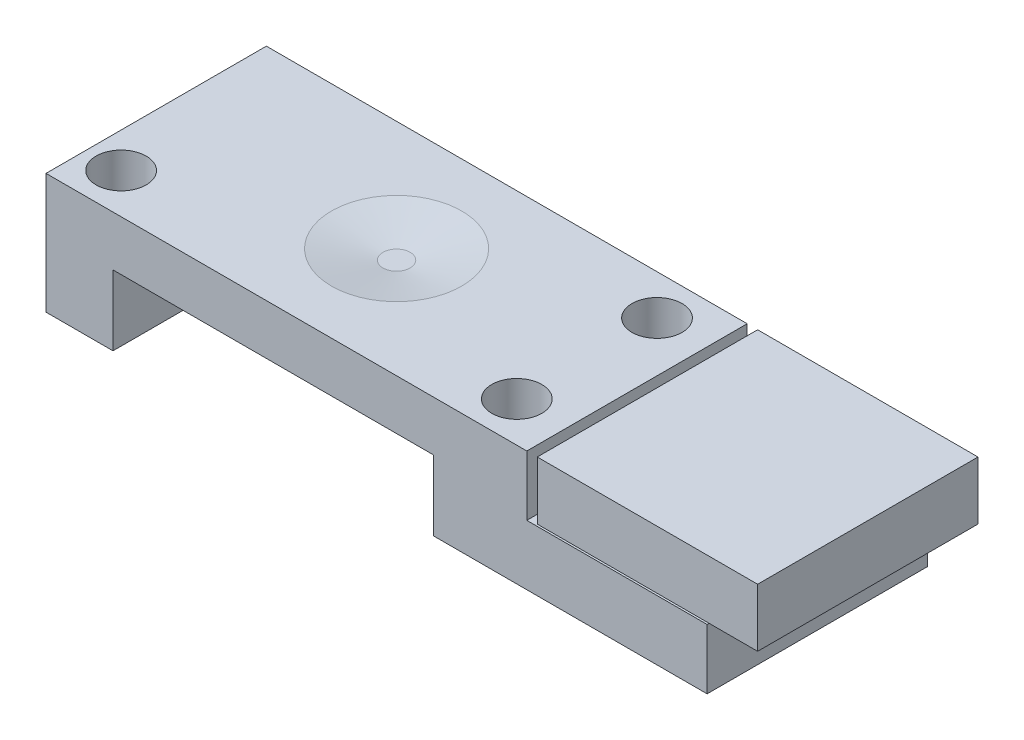
ISO-10303-21;
HEADER;
FILE_DESCRIPTION(('STEP AP214'),'2;1');
FILE_NAME('part.step','',(''),(''),'','','');
FILE_SCHEMA(('AUTOMOTIVE_DESIGN { 1 0 10303 214 1 1 1 1 }'));
ENDSEC;
DATA;
#1=APPLICATION_CONTEXT('core data for automotive mechanical design processes');
#2=APPLICATION_PROTOCOL_DEFINITION('international standard','automotive_design',2000,#1);
#3=PRODUCT_CONTEXT('',#1,'mechanical');
#4=PRODUCT('Part','Part','',(#3));
#5=PRODUCT_RELATED_PRODUCT_CATEGORY('part','',(#4));
#6=PRODUCT_DEFINITION_FORMATION('','',#4);
#7=PRODUCT_DEFINITION_CONTEXT('part definition',#1,'design');
#8=PRODUCT_DEFINITION('design','',#6,#7);
#9=PRODUCT_DEFINITION_SHAPE('','',#8);
#10=(LENGTH_UNIT() NAMED_UNIT(*) SI_UNIT(.MILLI.,.METRE.));
#11=(NAMED_UNIT(*) PLANE_ANGLE_UNIT() SI_UNIT($,.RADIAN.));
#12=(NAMED_UNIT(*) SI_UNIT($,.STERADIAN.) SOLID_ANGLE_UNIT());
#13=UNCERTAINTY_MEASURE_WITH_UNIT(LENGTH_MEASURE(1.E-05),#10,'distance_accuracy_value','');
#14=(GEOMETRIC_REPRESENTATION_CONTEXT(3) GLOBAL_UNCERTAINTY_ASSIGNED_CONTEXT((#13)) GLOBAL_UNIT_ASSIGNED_CONTEXT((#10,
#11,#12)) REPRESENTATION_CONTEXT('',''));
#15=CARTESIAN_POINT('',(0.,0.,0.));
#16=DIRECTION('',(0.,0.,1.));
#17=DIRECTION('',(1.,0.,0.));
#18=AXIS2_PLACEMENT_3D('',#15,#16,#17);
#19=CARTESIAN_POINT('',(24.5211285771673,6.,0.));
#20=DIRECTION('',(-1.,0.,0.));
#21=DIRECTION('',(0.,0.,1.));
#22=AXIS2_PLACEMENT_3D('',#19,#20,#21);
#23=PLANE('',#22);
#24=DIRECTION('',(0.,-1.,0.));
#25=VECTOR('',#24,1.);
#26=CARTESIAN_POINT('',(24.5211285771673,6.,11.));
#27=LINE('',#26,#25);
#28=CARTESIAN_POINT('',(24.5211285771673,6.,11.));
#29=VERTEX_POINT('',#28);
#30=CARTESIAN_POINT('',(24.5211285771673,3.1,11.));
#31=VERTEX_POINT('',#30);
#32=EDGE_CURVE('E110',#29,#31,#27,.T.);
#33=ORIENTED_EDGE('',*,*,#32,.F.);
#34=DIRECTION('',(0.,0.,1.));
#35=VECTOR('',#34,1.);
#36=CARTESIAN_POINT('',(24.5211285771673,6.,0.));
#37=LINE('',#36,#35);
#38=CARTESIAN_POINT('',(24.5211285771673,6.,0.));
#39=VERTEX_POINT('',#38);
#40=EDGE_CURVE('E12',#39,#29,#37,.T.);
#41=ORIENTED_EDGE('',*,*,#40,.F.);
#42=DIRECTION('',(0.,-1.,0.));
#43=VECTOR('',#42,1.);
#44=CARTESIAN_POINT('',(24.5211285771673,6.,0.));
#45=LINE('',#44,#43);
#46=CARTESIAN_POINT('',(24.5211285771673,3.1,0.));
#47=VERTEX_POINT('',#46);
#48=EDGE_CURVE('E104',#39,#47,#45,.T.);
#49=ORIENTED_EDGE('',*,*,#48,.T.);
#50=DIRECTION('',(0.,0.,1.));
#51=VECTOR('',#50,1.);
#52=CARTESIAN_POINT('',(24.5211285771673,3.1,0.));
#53=LINE('',#52,#51);
#54=EDGE_CURVE('E49',#47,#31,#53,.T.);
#55=ORIENTED_EDGE('',*,*,#54,.T.);
#56=EDGE_LOOP('',(#33,#41,#49,#55));
#57=FACE_BOUND('',#56,.T.);
#58=ADVANCED_FACE('F46',(#57),#23,.T.);
#59=CARTESIAN_POINT('',(24.5211285771673,6.,0.));
#60=DIRECTION('',(0.,1.,0.));
#61=DIRECTION('',(-1.,0.,0.));
#62=AXIS2_PLACEMENT_3D('',#59,#60,#61);
#63=PLANE('',#62);
#64=DIRECTION('',(-1.,0.,0.));
#65=VECTOR('',#64,1.);
#66=CARTESIAN_POINT('',(24.5211285771673,6.,11.));
#67=LINE('',#66,#65);
#68=CARTESIAN_POINT('',(35.5211285771673,6.,11.));
#69=VERTEX_POINT('',#68);
#70=EDGE_CURVE('E106',#69,#29,#67,.T.);
#71=ORIENTED_EDGE('',*,*,#70,.F.);
#72=DIRECTION('',(0.,0.,1.));
#73=VECTOR('',#72,1.);
#74=CARTESIAN_POINT('',(35.5211285771673,6.,0.));
#75=LINE('',#74,#73);
#76=CARTESIAN_POINT('',(35.5211285771673,6.,0.));
#77=VERTEX_POINT('',#76);
#78=EDGE_CURVE('E55',#77,#69,#75,.T.);
#79=ORIENTED_EDGE('',*,*,#78,.F.);
#80=DIRECTION('',(-1.,0.,0.));
#81=VECTOR('',#80,1.);
#82=CARTESIAN_POINT('',(24.5211285771673,6.,0.));
#83=LINE('',#82,#81);
#84=EDGE_CURVE('E101',#77,#39,#83,.T.);
#85=ORIENTED_EDGE('',*,*,#84,.T.);
#86=ORIENTED_EDGE('',*,*,#40,.T.);
#87=EDGE_LOOP('',(#71,#79,#85,#86));
#88=FACE_BOUND('',#87,.T.);
#89=ADVANCED_FACE('F120',(#88),#63,.T.);
#90=CARTESIAN_POINT('',(35.5211285771673,6.,0.));
#91=DIRECTION('',(1.,0.,0.));
#92=DIRECTION('',(0.,0.,-1.));
#93=AXIS2_PLACEMENT_3D('',#90,#91,#92);
#94=PLANE('',#93);
#95=DIRECTION('',(0.,1.,0.));
#96=VECTOR('',#95,1.);
#97=CARTESIAN_POINT('',(35.5211285771673,6.,11.));
#98=LINE('',#97,#96);
#99=CARTESIAN_POINT('',(35.5211285771673,3.1,11.));
#100=VERTEX_POINT('',#99);
#101=EDGE_CURVE('E96',#100,#69,#98,.T.);
#102=ORIENTED_EDGE('',*,*,#101,.F.);
#103=DIRECTION('',(0.,0.,1.));
#104=VECTOR('',#103,1.);
#105=CARTESIAN_POINT('',(35.5211285771673,3.1,0.));
#106=LINE('',#105,#104);
#107=CARTESIAN_POINT('',(35.5211285771673,3.1,0.));
#108=VERTEX_POINT('',#107);
#109=EDGE_CURVE('E91',#108,#100,#106,.T.);
#110=ORIENTED_EDGE('',*,*,#109,.F.);
#111=DIRECTION('',(0.,1.,0.));
#112=VECTOR('',#111,1.);
#113=CARTESIAN_POINT('',(35.5211285771673,6.,0.));
#114=LINE('',#113,#112);
#115=EDGE_CURVE('E94',#108,#77,#114,.T.);
#116=ORIENTED_EDGE('',*,*,#115,.T.);
#117=ORIENTED_EDGE('',*,*,#78,.T.);
#118=EDGE_LOOP('',(#102,#110,#116,#117));
#119=FACE_BOUND('',#118,.T.);
#120=ADVANCED_FACE('F93',(#119),#94,.T.);
#121=CARTESIAN_POINT('',(24.5211285771673,3.1,0.));
#122=DIRECTION('',(0.,-1.,0.));
#123=DIRECTION('',(0.,0.,-1.));
#124=AXIS2_PLACEMENT_3D('',#121,#122,#123);
#125=PLANE('',#124);
#126=DIRECTION('',(1.,0.,0.));
#127=VECTOR('',#126,1.);
#128=CARTESIAN_POINT('',(24.5211285771673,3.1,11.));
#129=LINE('',#128,#127);
#130=EDGE_CURVE('E113',#31,#100,#129,.T.);
#131=ORIENTED_EDGE('',*,*,#130,.F.);
#132=ORIENTED_EDGE('',*,*,#54,.F.);
#133=DIRECTION('',(1.,0.,0.));
#134=VECTOR('',#133,1.);
#135=CARTESIAN_POINT('',(24.5211285771673,3.1,0.));
#136=LINE('',#135,#134);
#137=EDGE_CURVE('E100',#47,#108,#136,.T.);
#138=ORIENTED_EDGE('',*,*,#137,.T.);
#139=ORIENTED_EDGE('',*,*,#109,.T.);
#140=EDGE_LOOP('',(#131,#132,#138,#139));
#141=FACE_BOUND('',#140,.T.);
#142=ADVANCED_FACE('F103',(#141),#125,.T.);
#143=CARTESIAN_POINT('',(0.,0.,0.));
#144=DIRECTION('',(0.,0.,1.));
#145=DIRECTION('',(1.,0.,0.));
#146=AXIS2_PLACEMENT_3D('',#143,#144,#145);
#147=PLANE('',#146);
#148=ORIENTED_EDGE('',*,*,#48,.F.);
#149=ORIENTED_EDGE('',*,*,#84,.F.);
#150=ORIENTED_EDGE('',*,*,#115,.F.);
#151=ORIENTED_EDGE('',*,*,#137,.F.);
#152=EDGE_LOOP('',(#148,#149,#150,#151));
#153=FACE_BOUND('',#152,.T.);
#154=ADVANCED_FACE('F99',(#153),#147,.F.);
#155=CARTESIAN_POINT('',(0.,0.,11.));
#156=DIRECTION('',(0.,0.,1.));
#157=DIRECTION('',(1.,0.,0.));
#158=AXIS2_PLACEMENT_3D('',#155,#156,#157);
#159=PLANE('',#158);
#160=ORIENTED_EDGE('',*,*,#32,.T.);
#161=ORIENTED_EDGE('',*,*,#130,.T.);
#162=ORIENTED_EDGE('',*,*,#101,.T.);
#163=ORIENTED_EDGE('',*,*,#70,.T.);
#164=EDGE_LOOP('',(#160,#161,#162,#163));
#165=FACE_BOUND('',#164,.T.);
#166=ADVANCED_FACE('F119',(#165),#159,.T.);
#167=CLOSED_SHELL('',(#58,#89,#120,#142,#154,#166));
#168=MANIFOLD_SOLID_BREP('B2',#167);
#169=CARTESIAN_POINT('',(0.,0.,11.));
#170=DIRECTION('',(1.,0.,0.));
#171=DIRECTION('',(0.,0.,-1.));
#172=AXIS2_PLACEMENT_3D('',#169,#170,#171);
#173=PLANE('',#172);
#174=DIRECTION('',(0.,-1.,0.));
#175=VECTOR('',#174,1.);
#176=CARTESIAN_POINT('',(0.,0.,0.));
#177=LINE('',#176,#175);
#178=CARTESIAN_POINT('',(0.,6.,0.));
#179=VERTEX_POINT('',#178);
#180=CARTESIAN_POINT('',(0.,0.,0.));
#181=VERTEX_POINT('',#180);
#182=EDGE_CURVE('E277',#179,#181,#177,.T.);
#183=ORIENTED_EDGE('',*,*,#182,.T.);
#184=DIRECTION('',(0.,0.,-1.));
#185=VECTOR('',#184,1.);
#186=CARTESIAN_POINT('',(0.,0.,11.));
#187=LINE('',#186,#185);
#188=CARTESIAN_POINT('',(0.,0.,11.));
#189=VERTEX_POINT('',#188);
#190=EDGE_CURVE('E44',#189,#181,#187,.T.);
#191=ORIENTED_EDGE('',*,*,#190,.F.);
#192=DIRECTION('',(0.,-1.,0.));
#193=VECTOR('',#192,1.);
#194=CARTESIAN_POINT('',(0.,0.,11.));
#195=LINE('',#194,#193);
#196=CARTESIAN_POINT('',(0.,6.,11.));
#197=VERTEX_POINT('',#196);
#198=EDGE_CURVE('E297',#197,#189,#195,.T.);
#199=ORIENTED_EDGE('',*,*,#198,.F.);
#200=DIRECTION('',(0.,0.,-1.));
#201=VECTOR('',#200,1.);
#202=CARTESIAN_POINT('',(0.,6.,11.));
#203=LINE('',#202,#201);
#204=EDGE_CURVE('E273',#197,#179,#203,.T.);
#205=ORIENTED_EDGE('',*,*,#204,.T.);
#206=EDGE_LOOP('',(#183,#191,#199,#205));
#207=FACE_BOUND('',#206,.T.);
#208=ADVANCED_FACE('F169',(#207),#173,.F.);
#209=CARTESIAN_POINT('',(0.,0.,11.));
#210=DIRECTION('',(0.,1.,0.));
#211=DIRECTION('',(0.,0.,1.));
#212=AXIS2_PLACEMENT_3D('',#209,#210,#211);
#213=PLANE('',#212);
#214=CARTESIAN_POINT('',(1.75,0.,9.));
#215=DIRECTION('',(0.,1.,0.));
#216=DIRECTION('',(0.,0.,1.));
#217=AXIS2_PLACEMENT_3D('',#214,#215,#216);
#218=CIRCLE('',#217,1.25);
#219=CARTESIAN_POINT('',(1.75,0.,10.25));
#220=VERTEX_POINT('',#219);
#221=EDGE_CURVE('E354',#220,#220,#218,.T.);
#222=ORIENTED_EDGE('',*,*,#221,.T.);
#223=EDGE_LOOP('',(#222));
#224=FACE_BOUND('',#223,.T.);
#225=DIRECTION('',(1.,0.,0.));
#226=VECTOR('',#225,1.);
#227=CARTESIAN_POINT('',(0.,0.,0.));
#228=LINE('',#227,#226);
#229=CARTESIAN_POINT('',(3.34378758545732,0.,0.));
#230=VERTEX_POINT('',#229);
#231=EDGE_CURVE('E280',#181,#230,#228,.T.);
#232=ORIENTED_EDGE('',*,*,#231,.T.);
#233=DIRECTION('',(0.,0.,-1.));
#234=VECTOR('',#233,1.);
#235=CARTESIAN_POINT('',(3.34378758545732,0.,11.));
#236=LINE('',#235,#234);
#237=CARTESIAN_POINT('',(3.34378758545732,0.,11.));
#238=VERTEX_POINT('',#237);
#239=EDGE_CURVE('E177',#238,#230,#236,.T.);
#240=ORIENTED_EDGE('',*,*,#239,.F.);
#241=DIRECTION('',(1.,0.,0.));
#242=VECTOR('',#241,1.);
#243=CARTESIAN_POINT('',(0.,0.,11.));
#244=LINE('',#243,#242);
#245=EDGE_CURVE('E234',#189,#238,#244,.T.);
#246=ORIENTED_EDGE('',*,*,#245,.F.);
#247=ORIENTED_EDGE('',*,*,#190,.T.);
#248=EDGE_LOOP('',(#232,#240,#246,#247));
#249=FACE_BOUND('',#248,.T.);
#250=ADVANCED_FACE('F395',(#224,#249),#213,.F.);
#251=CARTESIAN_POINT('',(3.34378758545732,0.,11.));
#252=DIRECTION('',(-1.,0.,0.));
#253=DIRECTION('',(0.,0.,1.));
#254=AXIS2_PLACEMENT_3D('',#251,#252,#253);
#255=PLANE('',#254);
#256=DIRECTION('',(0.,1.,0.));
#257=VECTOR('',#256,1.);
#258=CARTESIAN_POINT('',(3.34378758545732,0.,0.));
#259=LINE('',#258,#257);
#260=CARTESIAN_POINT('',(3.34378758545732,3.5,0.));
#261=VERTEX_POINT('',#260);
#262=EDGE_CURVE('E283',#230,#261,#259,.T.);
#263=ORIENTED_EDGE('',*,*,#262,.T.);
#264=DIRECTION('',(0.,0.,-1.));
#265=VECTOR('',#264,1.);
#266=CARTESIAN_POINT('',(3.34378758545732,3.5,11.));
#267=LINE('',#266,#265);
#268=CARTESIAN_POINT('',(3.34378758545732,3.5,11.));
#269=VERTEX_POINT('',#268);
#270=EDGE_CURVE('E310',#269,#261,#267,.T.);
#271=ORIENTED_EDGE('',*,*,#270,.F.);
#272=DIRECTION('',(0.,1.,0.));
#273=VECTOR('',#272,1.);
#274=CARTESIAN_POINT('',(3.34378758545732,0.,11.));
#275=LINE('',#274,#273);
#276=EDGE_CURVE('E318',#238,#269,#275,.T.);
#277=ORIENTED_EDGE('',*,*,#276,.F.);
#278=ORIENTED_EDGE('',*,*,#239,.T.);
#279=EDGE_LOOP('',(#263,#271,#277,#278));
#280=FACE_BOUND('',#279,.T.);
#281=ADVANCED_FACE('F316',(#280),#255,.F.);
#282=CARTESIAN_POINT('',(3.34378758545732,3.5,11.));
#283=DIRECTION('',(0.,1.,0.));
#284=DIRECTION('',(0.,0.,1.));
#285=AXIS2_PLACEMENT_3D('',#282,#283,#284);
#286=PLANE('',#285);
#287=DIRECTION('',(1.,0.,0.));
#288=VECTOR('',#287,1.);
#289=CARTESIAN_POINT('',(3.34378758545732,3.5,0.));
#290=LINE('',#289,#288);
#291=CARTESIAN_POINT('',(19.3437875854573,3.5,0.));
#292=VERTEX_POINT('',#291);
#293=EDGE_CURVE('E285',#261,#292,#290,.T.);
#294=ORIENTED_EDGE('',*,*,#293,.T.);
#295=DIRECTION('',(0.,0.,-1.));
#296=VECTOR('',#295,1.);
#297=CARTESIAN_POINT('',(19.3437875854573,3.5,11.));
#298=LINE('',#297,#296);
#299=CARTESIAN_POINT('',(19.3437875854573,3.5,11.));
#300=VERTEX_POINT('',#299);
#301=EDGE_CURVE('E307',#300,#292,#298,.T.);
#302=ORIENTED_EDGE('',*,*,#301,.F.);
#303=DIRECTION('',(1.,0.,0.));
#304=VECTOR('',#303,1.);
#305=CARTESIAN_POINT('',(3.34378758545732,3.5,11.));
#306=LINE('',#305,#304);
#307=EDGE_CURVE('E335',#269,#300,#306,.T.);
#308=ORIENTED_EDGE('',*,*,#307,.F.);
#309=ORIENTED_EDGE('',*,*,#270,.T.);
#310=EDGE_LOOP('',(#294,#302,#308,#309));
#311=FACE_BOUND('',#310,.T.);
#312=ADVANCED_FACE('F326',(#311),#286,.F.);
#313=CARTESIAN_POINT('',(19.3437875854573,0.,11.));
#314=DIRECTION('',(1.,0.,0.));
#315=DIRECTION('',(0.,0.,-1.));
#316=AXIS2_PLACEMENT_3D('',#313,#314,#315);
#317=PLANE('',#316);
#318=DIRECTION('',(0.,-1.,0.));
#319=VECTOR('',#318,1.);
#320=CARTESIAN_POINT('',(19.3437875854573,0.,0.));
#321=LINE('',#320,#319);
#322=CARTESIAN_POINT('',(19.3437875854573,0.,0.));
#323=VERTEX_POINT('',#322);
#324=EDGE_CURVE('E287',#292,#323,#321,.T.);
#325=ORIENTED_EDGE('',*,*,#324,.T.);
#326=DIRECTION('',(0.,0.,-1.));
#327=VECTOR('',#326,1.);
#328=CARTESIAN_POINT('',(19.3437875854573,0.,11.));
#329=LINE('',#328,#327);
#330=CARTESIAN_POINT('',(19.3437875854573,0.,11.));
#331=VERTEX_POINT('',#330);
#332=EDGE_CURVE('E304',#331,#323,#329,.T.);
#333=ORIENTED_EDGE('',*,*,#332,.F.);
#334=DIRECTION('',(0.,-1.,0.));
#335=VECTOR('',#334,1.);
#336=CARTESIAN_POINT('',(19.3437875854573,0.,11.));
#337=LINE('',#336,#335);
#338=EDGE_CURVE('E332',#300,#331,#337,.T.);
#339=ORIENTED_EDGE('',*,*,#338,.F.);
#340=ORIENTED_EDGE('',*,*,#301,.T.);
#341=EDGE_LOOP('',(#325,#333,#339,#340));
#342=FACE_BOUND('',#341,.T.);
#343=ADVANCED_FACE('F330',(#342),#317,.F.);
#344=CARTESIAN_POINT('',(24.,0.,11.));
#345=DIRECTION('',(0.,1.,0.));
#346=DIRECTION('',(0.,0.,1.));
#347=AXIS2_PLACEMENT_3D('',#344,#345,#346);
#348=PLANE('',#347);
#349=CARTESIAN_POINT('',(21.5,0.,2.));
#350=DIRECTION('',(0.,1.,0.));
#351=DIRECTION('',(0.,0.,1.));
#352=AXIS2_PLACEMENT_3D('',#349,#350,#351);
#353=CIRCLE('',#352,1.25);
#354=CARTESIAN_POINT('',(21.5,0.,3.25));
#355=VERTEX_POINT('',#354);
#356=EDGE_CURVE('E348',#355,#355,#353,.T.);
#357=ORIENTED_EDGE('',*,*,#356,.T.);
#358=EDGE_LOOP('',(#357));
#359=FACE_BOUND('',#358,.T.);
#360=CARTESIAN_POINT('',(21.5,0.,9.));
#361=DIRECTION('',(0.,1.,0.));
#362=DIRECTION('',(0.,0.,1.));
#363=AXIS2_PLACEMENT_3D('',#360,#361,#362);
#364=CIRCLE('',#363,1.25);
#365=CARTESIAN_POINT('',(21.5,0.,10.25));
#366=VERTEX_POINT('',#365);
#367=EDGE_CURVE('E281',#366,#366,#364,.T.);
#368=ORIENTED_EDGE('',*,*,#367,.T.);
#369=EDGE_LOOP('',(#368));
#370=FACE_BOUND('',#369,.T.);
#371=DIRECTION('',(1.,0.,0.));
#372=VECTOR('',#371,1.);
#373=CARTESIAN_POINT('',(24.,0.,0.));
#374=LINE('',#373,#372);
#375=CARTESIAN_POINT('',(33.,0.,0.));
#376=VERTEX_POINT('',#375);
#377=EDGE_CURVE('E290',#323,#376,#374,.T.);
#378=ORIENTED_EDGE('',*,*,#377,.T.);
#379=DIRECTION('',(0.,0.,-1.));
#380=VECTOR('',#379,1.);
#381=CARTESIAN_POINT('',(33.,0.,11.));
#382=LINE('',#381,#380);
#383=CARTESIAN_POINT('',(33.,0.,11.));
#384=VERTEX_POINT('',#383);
#385=EDGE_CURVE('E301',#384,#376,#382,.T.);
#386=ORIENTED_EDGE('',*,*,#385,.F.);
#387=DIRECTION('',(1.,0.,0.));
#388=VECTOR('',#387,1.);
#389=CARTESIAN_POINT('',(19.3437875854573,0.,11.));
#390=LINE('',#389,#388);
#391=EDGE_CURVE('E334',#331,#384,#390,.T.);
#392=ORIENTED_EDGE('',*,*,#391,.F.);
#393=ORIENTED_EDGE('',*,*,#332,.T.);
#394=EDGE_LOOP('',(#378,#386,#392,#393));
#395=FACE_BOUND('',#394,.T.);
#396=ADVANCED_FACE('F408',(#359,#370,#395),#348,.F.);
#397=CARTESIAN_POINT('',(33.,0.,11.));
#398=DIRECTION('',(-1.,0.,0.));
#399=DIRECTION('',(0.,0.,1.));
#400=AXIS2_PLACEMENT_3D('',#397,#398,#399);
#401=PLANE('',#400);
#402=DIRECTION('',(0.,1.,0.));
#403=VECTOR('',#402,1.);
#404=CARTESIAN_POINT('',(33.,0.,0.));
#405=LINE('',#404,#403);
#406=CARTESIAN_POINT('',(33.,3.,0.));
#407=VERTEX_POINT('',#406);
#408=EDGE_CURVE('E292',#376,#407,#405,.T.);
#409=ORIENTED_EDGE('',*,*,#408,.T.);
#410=DIRECTION('',(0.,0.,-1.));
#411=VECTOR('',#410,1.);
#412=CARTESIAN_POINT('',(33.,3.,11.));
#413=LINE('',#412,#411);
#414=CARTESIAN_POINT('',(33.,3.,11.));
#415=VERTEX_POINT('',#414);
#416=EDGE_CURVE('E268',#415,#407,#413,.T.);
#417=ORIENTED_EDGE('',*,*,#416,.F.);
#418=DIRECTION('',(0.,1.,0.));
#419=VECTOR('',#418,1.);
#420=CARTESIAN_POINT('',(33.,0.,11.));
#421=LINE('',#420,#419);
#422=EDGE_CURVE('E259',#384,#415,#421,.T.);
#423=ORIENTED_EDGE('',*,*,#422,.F.);
#424=ORIENTED_EDGE('',*,*,#385,.T.);
#425=EDGE_LOOP('',(#409,#417,#423,#424));
#426=FACE_BOUND('',#425,.T.);
#427=ADVANCED_FACE('F405',(#426),#401,.F.);
#428=CARTESIAN_POINT('',(24.,3.,11.));
#429=DIRECTION('',(0.,-1.,0.));
#430=DIRECTION('',(0.,0.,-1.));
#431=AXIS2_PLACEMENT_3D('',#428,#429,#430);
#432=PLANE('',#431);
#433=DIRECTION('',(-1.,0.,0.));
#434=VECTOR('',#433,1.);
#435=CARTESIAN_POINT('',(24.,3.,0.));
#436=LINE('',#435,#434);
#437=CARTESIAN_POINT('',(24.,3.,0.));
#438=VERTEX_POINT('',#437);
#439=EDGE_CURVE('E267',#407,#438,#436,.T.);
#440=ORIENTED_EDGE('',*,*,#439,.T.);
#441=DIRECTION('',(0.,0.,-1.));
#442=VECTOR('',#441,1.);
#443=CARTESIAN_POINT('',(24.,3.,11.));
#444=LINE('',#443,#442);
#445=CARTESIAN_POINT('',(24.,3.,11.));
#446=VERTEX_POINT('',#445);
#447=EDGE_CURVE('E264',#446,#438,#444,.T.);
#448=ORIENTED_EDGE('',*,*,#447,.F.);
#449=DIRECTION('',(-1.,0.,0.));
#450=VECTOR('',#449,1.);
#451=CARTESIAN_POINT('',(24.,3.,11.));
#452=LINE('',#451,#450);
#453=EDGE_CURVE('E253',#415,#446,#452,.T.);
#454=ORIENTED_EDGE('',*,*,#453,.F.);
#455=ORIENTED_EDGE('',*,*,#416,.T.);
#456=EDGE_LOOP('',(#440,#448,#454,#455));
#457=FACE_BOUND('',#456,.T.);
#458=ADVANCED_FACE('F265',(#457),#432,.F.);
#459=CARTESIAN_POINT('',(24.,3.,11.));
#460=DIRECTION('',(-1.,0.,0.));
#461=DIRECTION('',(0.,0.,1.));
#462=AXIS2_PLACEMENT_3D('',#459,#460,#461);
#463=PLANE('',#462);
#464=DIRECTION('',(0.,1.,0.));
#465=VECTOR('',#464,1.);
#466=CARTESIAN_POINT('',(24.,3.,0.));
#467=LINE('',#466,#465);
#468=CARTESIAN_POINT('',(24.,6.,0.));
#469=VERTEX_POINT('',#468);
#470=EDGE_CURVE('E220',#438,#469,#467,.T.);
#471=ORIENTED_EDGE('',*,*,#470,.T.);
#472=DIRECTION('',(0.,0.,-1.));
#473=VECTOR('',#472,1.);
#474=CARTESIAN_POINT('',(24.,6.,11.));
#475=LINE('',#474,#473);
#476=CARTESIAN_POINT('',(24.,6.,11.));
#477=VERTEX_POINT('',#476);
#478=EDGE_CURVE('E269',#477,#469,#475,.T.);
#479=ORIENTED_EDGE('',*,*,#478,.F.);
#480=DIRECTION('',(0.,1.,0.));
#481=VECTOR('',#480,1.);
#482=CARTESIAN_POINT('',(24.,3.,11.));
#483=LINE('',#482,#481);
#484=EDGE_CURVE('E257',#446,#477,#483,.T.);
#485=ORIENTED_EDGE('',*,*,#484,.F.);
#486=ORIENTED_EDGE('',*,*,#447,.T.);
#487=EDGE_LOOP('',(#471,#479,#485,#486));
#488=FACE_BOUND('',#487,.T.);
#489=ADVANCED_FACE('F271',(#488),#463,.F.);
#490=CARTESIAN_POINT('',(0.,6.,11.));
#491=DIRECTION('',(0.,-1.,0.));
#492=DIRECTION('',(0.,0.,-1.));
#493=AXIS2_PLACEMENT_3D('',#490,#491,#492);
#494=PLANE('',#493);
#495=CARTESIAN_POINT('',(12.,6.,5.5));
#496=DIRECTION('',(0.,1.,0.));
#497=DIRECTION('',(0.,0.,1.));
#498=AXIS2_PLACEMENT_3D('',#495,#496,#497);
#499=CIRCLE('',#498,3.25);
#500=CARTESIAN_POINT('',(12.,6.,8.75));
#501=VERTEX_POINT('',#500);
#502=EDGE_CURVE('E363',#501,#501,#499,.T.);
#503=ORIENTED_EDGE('',*,*,#502,.F.);
#504=EDGE_LOOP('',(#503));
#505=FACE_BOUND('',#504,.T.);
#506=CARTESIAN_POINT('',(1.75,6.,9.));
#507=DIRECTION('',(0.,1.,0.));
#508=DIRECTION('',(0.,0.,1.));
#509=AXIS2_PLACEMENT_3D('',#506,#507,#508);
#510=CIRCLE('',#509,1.24999999999999);
#511=CARTESIAN_POINT('',(1.75,6.,10.25));
#512=VERTEX_POINT('',#511);
#513=EDGE_CURVE('E357',#512,#512,#510,.T.);
#514=ORIENTED_EDGE('',*,*,#513,.F.);
#515=EDGE_LOOP('',(#514));
#516=FACE_BOUND('',#515,.T.);
#517=CARTESIAN_POINT('',(21.5,6.,2.));
#518=DIRECTION('',(0.,1.,0.));
#519=DIRECTION('',(0.,0.,1.));
#520=AXIS2_PLACEMENT_3D('',#517,#518,#519);
#521=CIRCLE('',#520,1.24999999999999);
#522=CARTESIAN_POINT('',(21.5,6.,3.24999999999999));
#523=VERTEX_POINT('',#522);
#524=EDGE_CURVE('E351',#523,#523,#521,.T.);
#525=ORIENTED_EDGE('',*,*,#524,.F.);
#526=EDGE_LOOP('',(#525));
#527=FACE_BOUND('',#526,.T.);
#528=CARTESIAN_POINT('',(21.5,6.,9.));
#529=DIRECTION('',(0.,1.,0.));
#530=DIRECTION('',(0.,0.,1.));
#531=AXIS2_PLACEMENT_3D('',#528,#529,#530);
#532=CIRCLE('',#531,1.24999999999999);
#533=CARTESIAN_POINT('',(21.5,6.,10.25));
#534=VERTEX_POINT('',#533);
#535=EDGE_CURVE('E345',#534,#534,#532,.T.);
#536=ORIENTED_EDGE('',*,*,#535,.F.);
#537=EDGE_LOOP('',(#536));
#538=FACE_BOUND('',#537,.T.);
#539=DIRECTION('',(-1.,0.,0.));
#540=VECTOR('',#539,1.);
#541=CARTESIAN_POINT('',(0.,6.,0.));
#542=LINE('',#541,#540);
#543=EDGE_CURVE('E226',#469,#179,#542,.T.);
#544=ORIENTED_EDGE('',*,*,#543,.T.);
#545=ORIENTED_EDGE('',*,*,#204,.F.);
#546=DIRECTION('',(-1.,0.,0.));
#547=VECTOR('',#546,1.);
#548=CARTESIAN_POINT('',(0.,6.,11.));
#549=LINE('',#548,#547);
#550=EDGE_CURVE('E185',#477,#197,#549,.T.);
#551=ORIENTED_EDGE('',*,*,#550,.F.);
#552=ORIENTED_EDGE('',*,*,#478,.T.);
#553=EDGE_LOOP('',(#544,#545,#551,#552));
#554=FACE_BOUND('',#553,.T.);
#555=ADVANCED_FACE('F369',(#505,#516,#527,#538,#554),#494,.F.);
#556=CARTESIAN_POINT('',(0.,0.,11.));
#557=DIRECTION('',(0.,0.,-1.));
#558=DIRECTION('',(-1.,0.,0.));
#559=AXIS2_PLACEMENT_3D('',#556,#557,#558);
#560=PLANE('',#559);
#561=ORIENTED_EDGE('',*,*,#198,.T.);
#562=ORIENTED_EDGE('',*,*,#245,.T.);
#563=ORIENTED_EDGE('',*,*,#276,.T.);
#564=ORIENTED_EDGE('',*,*,#307,.T.);
#565=ORIENTED_EDGE('',*,*,#338,.T.);
#566=ORIENTED_EDGE('',*,*,#391,.T.);
#567=ORIENTED_EDGE('',*,*,#422,.T.);
#568=ORIENTED_EDGE('',*,*,#453,.T.);
#569=ORIENTED_EDGE('',*,*,#484,.T.);
#570=ORIENTED_EDGE('',*,*,#550,.T.);
#571=EDGE_LOOP('',(#561,#562,#563,#564,#565,#566,#567,#568,#569,#570));
#572=FACE_BOUND('',#571,.T.);
#573=ADVANCED_FACE('F255',(#572),#560,.F.);
#574=CARTESIAN_POINT('',(0.,0.,0.));
#575=DIRECTION('',(0.,0.,-1.));
#576=DIRECTION('',(-1.,0.,0.));
#577=AXIS2_PLACEMENT_3D('',#574,#575,#576);
#578=PLANE('',#577);
#579=ORIENTED_EDGE('',*,*,#182,.F.);
#580=ORIENTED_EDGE('',*,*,#543,.F.);
#581=ORIENTED_EDGE('',*,*,#470,.F.);
#582=ORIENTED_EDGE('',*,*,#439,.F.);
#583=ORIENTED_EDGE('',*,*,#408,.F.);
#584=ORIENTED_EDGE('',*,*,#377,.F.);
#585=ORIENTED_EDGE('',*,*,#324,.F.);
#586=ORIENTED_EDGE('',*,*,#293,.F.);
#587=ORIENTED_EDGE('',*,*,#262,.F.);
#588=ORIENTED_EDGE('',*,*,#231,.F.);
#589=EDGE_LOOP('',(#579,#580,#581,#582,#583,#584,#585,#586,#587,#588));
#590=FACE_BOUND('',#589,.T.);
#591=ADVANCED_FACE('F322',(#590),#578,.T.);
#592=CARTESIAN_POINT('',(21.5,6.,9.));
#593=DIRECTION('',(0.,1.,0.));
#594=DIRECTION('',(0.,0.,1.));
#595=AXIS2_PLACEMENT_3D('',#592,#593,#594);
#596=CYLINDRICAL_SURFACE('',#595,1.24999999999999);
#597=ORIENTED_EDGE('',*,*,#367,.F.);
#598=EDGE_LOOP('',(#597));
#599=FACE_BOUND('',#598,.T.);
#600=ORIENTED_EDGE('',*,*,#535,.T.);
#601=EDGE_LOOP('',(#600));
#602=FACE_BOUND('',#601,.T.);
#603=ADVANCED_FACE('F379',(#599,#602),#596,.F.);
#604=CARTESIAN_POINT('',(21.5,6.,2.));
#605=DIRECTION('',(0.,1.,0.));
#606=DIRECTION('',(0.,0.,1.));
#607=AXIS2_PLACEMENT_3D('',#604,#605,#606);
#608=CYLINDRICAL_SURFACE('',#607,1.24999999999999);
#609=ORIENTED_EDGE('',*,*,#356,.F.);
#610=EDGE_LOOP('',(#609));
#611=FACE_BOUND('',#610,.T.);
#612=ORIENTED_EDGE('',*,*,#524,.T.);
#613=EDGE_LOOP('',(#612));
#614=FACE_BOUND('',#613,.T.);
#615=ADVANCED_FACE('F381',(#611,#614),#608,.F.);
#616=CARTESIAN_POINT('',(1.75,6.,9.));
#617=DIRECTION('',(0.,1.,0.));
#618=DIRECTION('',(0.,0.,1.));
#619=AXIS2_PLACEMENT_3D('',#616,#617,#618);
#620=CYLINDRICAL_SURFACE('',#619,1.24999999999999);
#621=ORIENTED_EDGE('',*,*,#221,.F.);
#622=EDGE_LOOP('',(#621));
#623=FACE_BOUND('',#622,.T.);
#624=ORIENTED_EDGE('',*,*,#513,.T.);
#625=EDGE_LOOP('',(#624));
#626=FACE_BOUND('',#625,.T.);
#627=ADVANCED_FACE('F388',(#623,#626),#620,.F.);
#628=CARTESIAN_POINT('',(12.,6.,5.5));
#629=DIRECTION('',(0.,1.,0.));
#630=DIRECTION('',(0.,0.,1.));
#631=AXIS2_PLACEMENT_3D('',#628,#629,#630);
#632=CONICAL_SURFACE('',#631,3.25,1.37881010907552);
#633=CARTESIAN_POINT('',(12.,5.5,5.5));
#634=DIRECTION('',(0.,1.,0.));
#635=DIRECTION('',(0.,0.,1.));
#636=AXIS2_PLACEMENT_3D('',#633,#634,#635);
#637=CIRCLE('',#636,0.677722992014805);
#638=CARTESIAN_POINT('',(12.,5.5,6.1777229920148));
#639=VERTEX_POINT('',#638);
#640=EDGE_CURVE('E360',#639,#639,#637,.T.);
#641=CARTESIAN_POINT('',(12.,5.5,6.1777229920148));
#642=CARTESIAN_POINT('',(12.,5.50520833333333,6.20451754418131));
#643=CARTESIAN_POINT('',(12.,5.51041666666667,6.23131209634783));
#644=CARTESIAN_POINT('',(12.,5.52083333333333,6.28490120068085));
#645=CARTESIAN_POINT('',(12.,5.52604166666667,6.31169575284736));
#646=CARTESIAN_POINT('',(12.,5.53645833333333,6.36528485718039));
#647=CARTESIAN_POINT('',(12.,5.54166666666667,6.3920794093469));
#648=CARTESIAN_POINT('',(12.,5.55208333333333,6.44566851367993));
#649=CARTESIAN_POINT('',(12.,5.55729166666667,6.47246306584644));
#650=CARTESIAN_POINT('',(12.,5.56770833333333,6.52605217017946));
#651=CARTESIAN_POINT('',(12.,5.57291666666667,6.55284672234598));
#652=CARTESIAN_POINT('',(12.,5.58333333333333,6.606435826679));
#653=CARTESIAN_POINT('',(12.,5.58854166666667,6.63323037884551));
#654=CARTESIAN_POINT('',(12.,5.59895833333333,6.68681948317854));
#655=CARTESIAN_POINT('',(12.,5.60416666666667,6.71361403534505));
#656=CARTESIAN_POINT('',(12.,5.61458333333333,6.76720313967808));
#657=CARTESIAN_POINT('',(12.,5.61979166666667,6.79399769184459));
#658=CARTESIAN_POINT('',(12.,5.63020833333333,6.84758679617761));
#659=CARTESIAN_POINT('',(12.,5.63541666666667,6.87438134834413));
#660=CARTESIAN_POINT('',(12.,5.64583333333333,6.92797045267715));
#661=CARTESIAN_POINT('',(12.,5.65104166666667,6.95476500484366));
#662=CARTESIAN_POINT('',(12.,5.66145833333333,7.00835410917669));
#663=CARTESIAN_POINT('',(12.,5.66666666666667,7.0351486613432));
#664=CARTESIAN_POINT('',(12.,5.67708333333333,7.08873776567622));
#665=CARTESIAN_POINT('',(12.,5.68229166666667,7.11553231784274));
#666=CARTESIAN_POINT('',(12.,5.69270833333333,7.16912142217576));
#667=CARTESIAN_POINT('',(12.,5.69791666666667,7.19591597434228));
#668=CARTESIAN_POINT('',(12.,5.70833333333333,7.2495050786753));
#669=CARTESIAN_POINT('',(12.,5.71354166666667,7.27629963084181));
#670=CARTESIAN_POINT('',(12.,5.72395833333333,7.32988873517484));
#671=CARTESIAN_POINT('',(12.,5.72916666666667,7.35668328734135));
#672=CARTESIAN_POINT('',(12.,5.73958333333333,7.41027239167437));
#673=CARTESIAN_POINT('',(12.,5.74479166666667,7.43706694384089));
#674=CARTESIAN_POINT('',(12.,5.75520833333333,7.49065604817391));
#675=CARTESIAN_POINT('',(12.,5.76041666666667,7.51745060034042));
#676=CARTESIAN_POINT('',(12.,5.77083333333333,7.57103970467345));
#677=CARTESIAN_POINT('',(12.,5.77604166666667,7.59783425683996));
#678=CARTESIAN_POINT('',(12.,5.78645833333333,7.65142336117299));
#679=CARTESIAN_POINT('',(12.,5.79166666666667,7.6782179133395));
#680=CARTESIAN_POINT('',(12.,5.80208333333333,7.73180701767252));
#681=CARTESIAN_POINT('',(12.,5.80729166666667,7.75860156983904));
#682=CARTESIAN_POINT('',(12.,5.81770833333333,7.81219067417206));
#683=CARTESIAN_POINT('',(12.,5.82291666666667,7.83898522633857));
#684=CARTESIAN_POINT('',(12.,5.83333333333333,7.8925743306716));
#685=CARTESIAN_POINT('',(12.,5.83854166666667,7.91936888283811));
#686=CARTESIAN_POINT('',(12.,5.84895833333333,7.97295798717114));
#687=CARTESIAN_POINT('',(12.,5.85416666666667,7.99975253933765));
#688=CARTESIAN_POINT('',(12.,5.86458333333333,8.05334164367067));
#689=CARTESIAN_POINT('',(12.,5.86979166666667,8.08013619583719));
#690=CARTESIAN_POINT('',(12.,5.88020833333333,8.13372530017021));
#691=CARTESIAN_POINT('',(12.,5.88541666666667,8.16051985233672));
#692=CARTESIAN_POINT('',(12.,5.89583333333333,8.21410895666975));
#693=CARTESIAN_POINT('',(12.,5.90104166666667,8.24090350883626));
#694=CARTESIAN_POINT('',(12.,5.91145833333333,8.29449261316928));
#695=CARTESIAN_POINT('',(12.,5.91666666666667,8.3212871653358));
#696=CARTESIAN_POINT('',(12.,5.92708333333333,8.37487626966882));
#697=CARTESIAN_POINT('',(12.,5.93229166666667,8.40167082183534));
#698=CARTESIAN_POINT('',(12.,5.94270833333333,8.45525992616836));
#699=CARTESIAN_POINT('',(12.,5.94791666666667,8.48205447833487));
#700=CARTESIAN_POINT('',(12.,5.95833333333333,8.5356435826679));
#701=CARTESIAN_POINT('',(12.,5.96354166666667,8.56243813483441));
#702=CARTESIAN_POINT('',(12.,5.97395833333333,8.61602723916744));
#703=CARTESIAN_POINT('',(12.,5.97916666666667,8.64282179133395));
#704=CARTESIAN_POINT('',(12.,5.98958333333333,8.69641089566697));
#705=CARTESIAN_POINT('',(12.,5.99479166666667,8.72320544783349));
#706=CARTESIAN_POINT('',(12.,6.,8.75));
#707=B_SPLINE_CURVE_WITH_KNOTS('',3,(#641,#642,#643,#644,#645,#646,#647,#648,#649,#650,#651,
#652,#653,#654,#655,#656,#657,#658,#659,#660,#661,#662,#663,#664,#665,#666,#667,#668,#669,#670,
#671,#672,#673,#674,#675,#676,#677,#678,#679,#680,#681,#682,#683,#684,#685,#686,#687,#688,#689,
#690,#691,#692,#693,#694,#695,#696,#697,#698,#699,#700,#701,#702,#703,#704,#705,#706),
.UNSPECIFIED.,.F.,.F.,(4,2,2,2,2,2,2,2,2,2,2,2,2,2,2,2,2,2,2,2,2,2,2,2,2,2,2,2,2,2,2,2,4),(0.,
0.0818881728776234,0.163776345755248,0.245664518632872,0.327552691510495,0.409440864388119,
0.491329037265744,0.573217210143367,0.655105383020991,0.736993555898615,0.818881728776239,
0.900769901653862,0.982658074531487,1.06454624740911,1.14643442028673,1.22832259316436,
1.31021076604198,1.39209893891961,1.47398711179723,1.55587528467485,1.63776345755248,
1.7196516304301,1.80153980330773,1.88342797618535,1.96531614906297,2.0472043219406,
2.12909249481822,2.21098066769585,2.29286884057347,2.37475701345109,2.45664518632872,
2.53853335920634,2.62042153208396),.UNSPECIFIED.);
#708=EDGE_CURVE('BSEAM367',#639,#501,#707,.T.);
#709=ORIENTED_EDGE('',*,*,#640,.F.);
#710=ORIENTED_EDGE('',*,*,#502,.T.);
#711=ORIENTED_EDGE('',*,*,#708,.T.);
#712=ORIENTED_EDGE('',*,*,#708,.F.);
#713=EDGE_LOOP('',(#709,#711,#710,#712));
#714=FACE_BOUND('',#713,.T.);
#715=ADVANCED_FACE('F367',(#714),#632,.F.);
#716=CARTESIAN_POINT('',(12.,5.5,5.5));
#717=DIRECTION('',(0.,1.,0.));
#718=DIRECTION('',(0.,0.,1.));
#719=AXIS2_PLACEMENT_3D('',#716,#717,#718);
#720=PLANE('',#719);
#721=ORIENTED_EDGE('',*,*,#640,.T.);
#722=EDGE_LOOP('',(#721));
#723=FACE_BOUND('',#722,.T.);
#724=ADVANCED_FACE('F514',(#723),#720,.T.);
#725=CLOSED_SHELL('',(#208,#250,#281,#312,#343,#396,#427,#458,#489,#555,#573,#591,#603,#615,
#627,#715,#724));
#726=MANIFOLD_SOLID_BREP('B6',#725);
#727=ADVANCED_BREP_SHAPE_REPRESENTATION('',(#18,#168,#726),#14);
#728=SHAPE_DEFINITION_REPRESENTATION(#9,#727);
ENDSEC;
END-ISO-10303-21;
